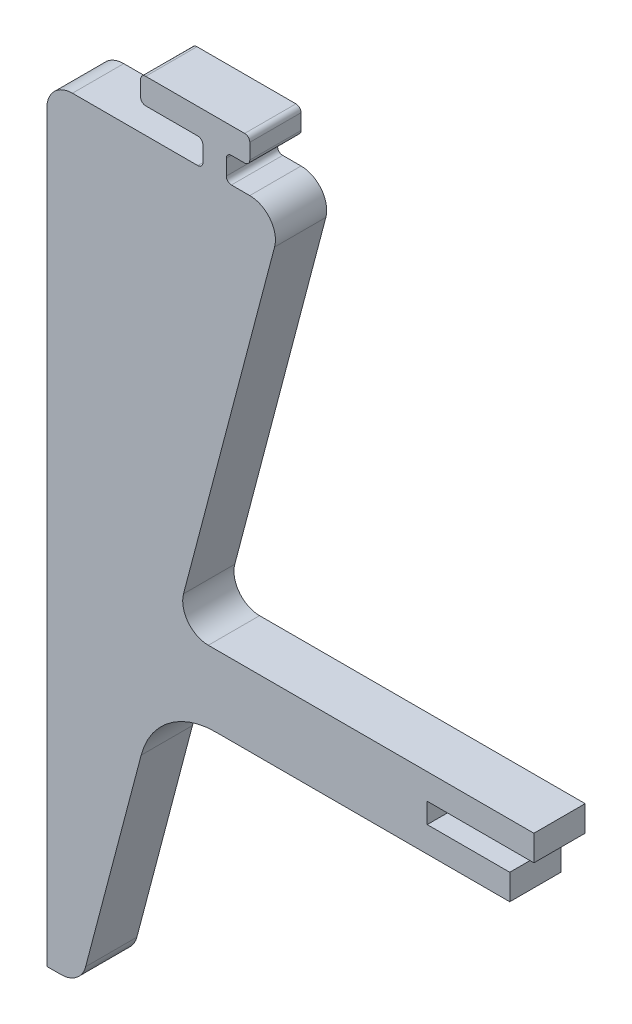
ISO-10303-21;
HEADER;
FILE_DESCRIPTION(('STEP AP214'),'2;1');
FILE_NAME('part.step','',(''),(''),'','','');
FILE_SCHEMA(('AUTOMOTIVE_DESIGN { 1 0 10303 214 1 1 1 1 }'));
ENDSEC;
DATA;
#1=APPLICATION_CONTEXT('core data for automotive mechanical design processes');
#2=APPLICATION_PROTOCOL_DEFINITION('international standard','automotive_design',2000,#1);
#3=PRODUCT_CONTEXT('',#1,'mechanical');
#4=PRODUCT('Part','Part','',(#3));
#5=PRODUCT_RELATED_PRODUCT_CATEGORY('part','',(#4));
#6=PRODUCT_DEFINITION_FORMATION('','',#4);
#7=PRODUCT_DEFINITION_CONTEXT('part definition',#1,'design');
#8=PRODUCT_DEFINITION('design','',#6,#7);
#9=PRODUCT_DEFINITION_SHAPE('','',#8);
#10=(LENGTH_UNIT() NAMED_UNIT(*) SI_UNIT(.MILLI.,.METRE.));
#11=(NAMED_UNIT(*) PLANE_ANGLE_UNIT() SI_UNIT($,.RADIAN.));
#12=(NAMED_UNIT(*) SI_UNIT($,.STERADIAN.) SOLID_ANGLE_UNIT());
#13=UNCERTAINTY_MEASURE_WITH_UNIT(LENGTH_MEASURE(1.E-05),#10,'distance_accuracy_value','');
#14=(GEOMETRIC_REPRESENTATION_CONTEXT(3) GLOBAL_UNCERTAINTY_ASSIGNED_CONTEXT((#13)) GLOBAL_UNIT_ASSIGNED_CONTEXT((#10,
#11,#12)) REPRESENTATION_CONTEXT('',''));
#15=CARTESIAN_POINT('',(0.,0.,0.));
#16=DIRECTION('',(0.,0.,1.));
#17=DIRECTION('',(1.,0.,0.));
#18=AXIS2_PLACEMENT_3D('',#15,#16,#17);
#19=CARTESIAN_POINT('',(-8.43477490578232,2.2206260896086,5.08));
#20=DIRECTION('',(0.96704776858186,-0.254594998538551,0.));
#21=DIRECTION('',(0.254594998538551,0.96704776858186,0.));
#22=AXIS2_PLACEMENT_3D('',#19,#20,#21);
#23=PLANE('',#22);
#24=DIRECTION('',(-0.254594998538551,-0.96704776858186,0.));
#25=VECTOR('',#24,1.);
#26=CARTESIAN_POINT('',(-8.43477490578232,2.2206260896086,5.08));
#27=LINE('',#26,#25);
#28=CARTESIAN_POINT('',(3.515777518992,47.613328703712,5.08));
#29=VERTEX_POINT('',#28);
#30=CARTESIAN_POINT('',(-5.50561715870605,13.3466712962879,5.08));
#31=VERTEX_POINT('',#30);
#32=EDGE_CURVE('E398',#29,#31,#27,.T.);
#33=ORIENTED_EDGE('',*,*,#32,.T.);
#34=DIRECTION('',(0.,0.,1.));
#35=VECTOR('',#34,1.);
#36=CARTESIAN_POINT('',(-5.50561715870605,13.3466712962879,-42.0535776026953));
#37=LINE('',#36,#35);
#38=CARTESIAN_POINT('',(-5.50561715870605,13.3466712962879,0.));
#39=VERTEX_POINT('',#38);
#40=EDGE_CURVE('E529',#39,#31,#37,.T.);
#41=ORIENTED_EDGE('',*,*,#40,.F.);
#42=DIRECTION('',(-0.254594998538551,-0.96704776858186,0.));
#43=VECTOR('',#42,1.);
#44=CARTESIAN_POINT('',(-8.43477490578232,2.2206260896086,0.));
#45=LINE('',#44,#43);
#46=CARTESIAN_POINT('',(3.515777518992,47.613328703712,0.));
#47=VERTEX_POINT('',#46);
#48=EDGE_CURVE('E280',#47,#39,#45,.T.);
#49=ORIENTED_EDGE('',*,*,#48,.F.);
#50=DIRECTION('',(0.,0.,-1.));
#51=VECTOR('',#50,1.);
#52=CARTESIAN_POINT('',(3.515777518992,47.613328703712,5.08));
#53=LINE('',#52,#51);
#54=EDGE_CURVE('E306',#29,#47,#53,.T.);
#55=ORIENTED_EDGE('',*,*,#54,.F.);
#56=EDGE_LOOP('',(#33,#41,#49,#55));
#57=FACE_BOUND('',#56,.T.);
#58=ADVANCED_FACE('F37',(#57),#23,.T.);
#59=CARTESIAN_POINT('',(0.551476186794056,53.848,5.08));
#60=DIRECTION('',(0.,0.,-1.));
#61=DIRECTION('',(-1.,0.,0.));
#62=AXIS2_PLACEMENT_3D('',#59,#60,#61);
#63=CYLINDRICAL_SURFACE('',#62,0.508000000000001);
#64=CARTESIAN_POINT('',(0.551476186794056,53.848,0.));
#65=DIRECTION('',(0.,0.,1.));
#66=DIRECTION('',(1.,0.,0.));
#67=AXIS2_PLACEMENT_3D('',#64,#65,#66);
#68=CIRCLE('',#67,0.508000000000001);
#69=CARTESIAN_POINT('',(1.05947618679406,53.848,0.));
#70=VERTEX_POINT('',#69);
#71=CARTESIAN_POINT('',(0.551476186794052,53.34,0.));
#72=VERTEX_POINT('',#71);
#73=EDGE_CURVE('E236',#70,#72,#68,.F.);
#74=ORIENTED_EDGE('',*,*,#73,.F.);
#75=DIRECTION('',(0.,0.,-1.));
#76=VECTOR('',#75,1.);
#77=CARTESIAN_POINT('',(1.05947618679406,53.848,5.08));
#78=LINE('',#77,#76);
#79=CARTESIAN_POINT('',(1.05947618679406,53.848,5.08));
#80=VERTEX_POINT('',#79);
#81=EDGE_CURVE('E11',#80,#70,#78,.T.);
#82=ORIENTED_EDGE('',*,*,#81,.F.);
#83=CARTESIAN_POINT('',(0.551476186794056,53.848,5.08));
#84=DIRECTION('',(0.,0.,1.));
#85=DIRECTION('',(1.,0.,0.));
#86=AXIS2_PLACEMENT_3D('',#83,#84,#85);
#87=CIRCLE('',#86,0.508000000000001);
#88=CARTESIAN_POINT('',(0.551476186794052,53.34,5.08));
#89=VERTEX_POINT('',#88);
#90=EDGE_CURVE('E298',#80,#89,#87,.F.);
#91=ORIENTED_EDGE('',*,*,#90,.T.);
#92=DIRECTION('',(0.,0.,-1.));
#93=VECTOR('',#92,1.);
#94=CARTESIAN_POINT('',(0.551476186794052,53.34,5.08));
#95=LINE('',#94,#93);
#96=EDGE_CURVE('E61',#89,#72,#95,.T.);
#97=ORIENTED_EDGE('',*,*,#96,.T.);
#98=EDGE_LOOP('',(#74,#82,#91,#97));
#99=FACE_BOUND('',#98,.T.);
#100=ADVANCED_FACE('F39',(#99),#63,.T.);
#101=CARTESIAN_POINT('',(1.05947618679406,0.,5.08));
#102=DIRECTION('',(1.,0.,0.));
#103=DIRECTION('',(0.,0.,-1.));
#104=AXIS2_PLACEMENT_3D('',#101,#102,#103);
#105=PLANE('',#104);
#106=DIRECTION('',(0.,-1.,0.));
#107=VECTOR('',#106,1.);
#108=CARTESIAN_POINT('',(1.05947618679406,0.,0.));
#109=LINE('',#108,#107);
#110=CARTESIAN_POINT('',(1.05947618679406,55.372,0.));
#111=VERTEX_POINT('',#110);
#112=EDGE_CURVE('E238',#111,#70,#109,.T.);
#113=ORIENTED_EDGE('',*,*,#112,.F.);
#114=DIRECTION('',(0.,0.,-1.));
#115=VECTOR('',#114,1.);
#116=CARTESIAN_POINT('',(1.05947618679406,55.372,5.08));
#117=LINE('',#116,#115);
#118=CARTESIAN_POINT('',(1.05947618679406,55.372,5.08));
#119=VERTEX_POINT('',#118);
#120=EDGE_CURVE('E45',#119,#111,#117,.T.);
#121=ORIENTED_EDGE('',*,*,#120,.F.);
#122=DIRECTION('',(0.,-1.,0.));
#123=VECTOR('',#122,1.);
#124=CARTESIAN_POINT('',(1.05947618679406,0.,5.08));
#125=LINE('',#124,#123);
#126=EDGE_CURVE('E364',#119,#80,#125,.T.);
#127=ORIENTED_EDGE('',*,*,#126,.T.);
#128=ORIENTED_EDGE('',*,*,#81,.T.);
#129=EDGE_LOOP('',(#113,#121,#127,#128));
#130=FACE_BOUND('',#129,.T.);
#131=ADVANCED_FACE('F351',(#130),#105,.T.);
#132=CARTESIAN_POINT('',(0.551476186794056,55.372,5.08));
#133=DIRECTION('',(0.,0.,-1.));
#134=DIRECTION('',(-1.,0.,0.));
#135=AXIS2_PLACEMENT_3D('',#132,#133,#134);
#136=CYLINDRICAL_SURFACE('',#135,0.508000000000001);
#137=CARTESIAN_POINT('',(0.551476186794056,55.372,0.));
#138=DIRECTION('',(0.,0.,1.));
#139=DIRECTION('',(1.,0.,0.));
#140=AXIS2_PLACEMENT_3D('',#137,#138,#139);
#141=CIRCLE('',#140,0.508000000000001);
#142=CARTESIAN_POINT('',(0.551476186794052,55.88,0.));
#143=VERTEX_POINT('',#142);
#144=EDGE_CURVE('E242',#143,#111,#141,.F.);
#145=ORIENTED_EDGE('',*,*,#144,.F.);
#146=DIRECTION('',(0.,0.,-1.));
#147=VECTOR('',#146,1.);
#148=CARTESIAN_POINT('',(0.551476186794052,55.88,5.08));
#149=LINE('',#148,#147);
#150=CARTESIAN_POINT('',(0.551476186794052,55.88,5.08));
#151=VERTEX_POINT('',#150);
#152=EDGE_CURVE('E340',#151,#143,#149,.T.);
#153=ORIENTED_EDGE('',*,*,#152,.F.);
#154=CARTESIAN_POINT('',(0.551476186794056,55.372,5.08));
#155=DIRECTION('',(0.,0.,1.));
#156=DIRECTION('',(1.,0.,0.));
#157=AXIS2_PLACEMENT_3D('',#154,#155,#156);
#158=CIRCLE('',#157,0.508000000000001);
#159=EDGE_CURVE('E347',#151,#119,#158,.F.);
#160=ORIENTED_EDGE('',*,*,#159,.T.);
#161=ORIENTED_EDGE('',*,*,#120,.T.);
#162=EDGE_LOOP('',(#145,#153,#160,#161));
#163=FACE_BOUND('',#162,.T.);
#164=ADVANCED_FACE('F345',(#163),#136,.T.);
#165=CARTESIAN_POINT('',(0.,55.88,5.08));
#166=DIRECTION('',(0.,1.,0.));
#167=DIRECTION('',(0.,0.,1.));
#168=AXIS2_PLACEMENT_3D('',#165,#166,#167);
#169=PLANE('',#168);
#170=DIRECTION('',(1.,0.,0.));
#171=VECTOR('',#170,1.);
#172=CARTESIAN_POINT('',(0.,55.88,0.));
#173=LINE('',#172,#171);
#174=CARTESIAN_POINT('',(-9.2514879293255,55.88,0.));
#175=VERTEX_POINT('',#174);
#176=EDGE_CURVE('E245',#175,#143,#173,.T.);
#177=ORIENTED_EDGE('',*,*,#176,.F.);
#178=DIRECTION('',(0.,0.,-1.));
#179=VECTOR('',#178,1.);
#180=CARTESIAN_POINT('',(-9.2514879293255,55.88,5.08));
#181=LINE('',#180,#179);
#182=CARTESIAN_POINT('',(-9.2514879293255,55.88,5.08));
#183=VERTEX_POINT('',#182);
#184=EDGE_CURVE('E338',#183,#175,#181,.T.);
#185=ORIENTED_EDGE('',*,*,#184,.F.);
#186=DIRECTION('',(1.,0.,0.));
#187=VECTOR('',#186,1.);
#188=CARTESIAN_POINT('',(0.,55.88,5.08));
#189=LINE('',#188,#187);
#190=EDGE_CURVE('E361',#183,#151,#189,.T.);
#191=ORIENTED_EDGE('',*,*,#190,.T.);
#192=ORIENTED_EDGE('',*,*,#152,.T.);
#193=EDGE_LOOP('',(#177,#185,#191,#192));
#194=FACE_BOUND('',#193,.T.);
#195=ADVANCED_FACE('F358',(#194),#169,.T.);
#196=CARTESIAN_POINT('',(-9.25148792932551,55.372,5.08));
#197=DIRECTION('',(0.,0.,-1.));
#198=DIRECTION('',(-1.,0.,0.));
#199=AXIS2_PLACEMENT_3D('',#196,#197,#198);
#200=CYLINDRICAL_SURFACE('',#199,0.508000000000001);
#201=CARTESIAN_POINT('',(-9.25148792932551,55.372,0.));
#202=DIRECTION('',(0.,0.,1.));
#203=DIRECTION('',(1.,0.,0.));
#204=AXIS2_PLACEMENT_3D('',#201,#202,#203);
#205=CIRCLE('',#204,0.508000000000001);
#206=CARTESIAN_POINT('',(-9.75948792932551,55.372,0.));
#207=VERTEX_POINT('',#206);
#208=EDGE_CURVE('E248',#207,#175,#205,.F.);
#209=ORIENTED_EDGE('',*,*,#208,.F.);
#210=DIRECTION('',(0.,0.,-1.));
#211=VECTOR('',#210,1.);
#212=CARTESIAN_POINT('',(-9.75948792932551,55.372,5.08));
#213=LINE('',#212,#211);
#214=CARTESIAN_POINT('',(-9.75948792932551,55.372,5.08));
#215=VERTEX_POINT('',#214);
#216=EDGE_CURVE('E336',#215,#207,#213,.T.);
#217=ORIENTED_EDGE('',*,*,#216,.F.);
#218=CARTESIAN_POINT('',(-9.25148792932551,55.372,5.08));
#219=DIRECTION('',(0.,0.,1.));
#220=DIRECTION('',(1.,0.,0.));
#221=AXIS2_PLACEMENT_3D('',#218,#219,#220);
#222=CIRCLE('',#221,0.508000000000001);
#223=EDGE_CURVE('E366',#215,#183,#222,.F.);
#224=ORIENTED_EDGE('',*,*,#223,.T.);
#225=ORIENTED_EDGE('',*,*,#184,.T.);
#226=EDGE_LOOP('',(#209,#217,#224,#225));
#227=FACE_BOUND('',#226,.T.);
#228=ADVANCED_FACE('F851',(#227),#200,.T.);
#229=CARTESIAN_POINT('',(-9.75948792932551,0.,5.08));
#230=DIRECTION('',(1.,0.,0.));
#231=DIRECTION('',(0.,0.,-1.));
#232=AXIS2_PLACEMENT_3D('',#229,#230,#231);
#233=PLANE('',#232);
#234=DIRECTION('',(0.,-1.,0.));
#235=VECTOR('',#234,1.);
#236=CARTESIAN_POINT('',(-9.75948792932551,0.,0.));
#237=LINE('',#236,#235);
#238=CARTESIAN_POINT('',(-9.75948792932551,53.848,0.));
#239=VERTEX_POINT('',#238);
#240=EDGE_CURVE('E251',#207,#239,#237,.T.);
#241=ORIENTED_EDGE('',*,*,#240,.T.);
#242=DIRECTION('',(0.,0.,-1.));
#243=VECTOR('',#242,1.);
#244=CARTESIAN_POINT('',(-9.75948792932551,53.848,5.08));
#245=LINE('',#244,#243);
#246=CARTESIAN_POINT('',(-9.75948792932551,53.848,5.08));
#247=VERTEX_POINT('',#246);
#248=EDGE_CURVE('E333',#247,#239,#245,.T.);
#249=ORIENTED_EDGE('',*,*,#248,.F.);
#250=DIRECTION('',(0.,-1.,0.));
#251=VECTOR('',#250,1.);
#252=CARTESIAN_POINT('',(-9.75948792932551,0.,5.08));
#253=LINE('',#252,#251);
#254=EDGE_CURVE('E372',#215,#247,#253,.T.);
#255=ORIENTED_EDGE('',*,*,#254,.F.);
#256=ORIENTED_EDGE('',*,*,#216,.T.);
#257=EDGE_LOOP('',(#241,#249,#255,#256));
#258=FACE_BOUND('',#257,.T.);
#259=ADVANCED_FACE('F841',(#258),#233,.F.);
#260=CARTESIAN_POINT('',(-9.25148792932551,53.848,5.08));
#261=DIRECTION('',(0.,0.,-1.));
#262=DIRECTION('',(-1.,0.,0.));
#263=AXIS2_PLACEMENT_3D('',#260,#261,#262);
#264=CYLINDRICAL_SURFACE('',#263,0.508000000000001);
#265=CARTESIAN_POINT('',(-9.25148792932551,53.848,0.));
#266=DIRECTION('',(0.,0.,1.));
#267=DIRECTION('',(1.,0.,0.));
#268=AXIS2_PLACEMENT_3D('',#265,#266,#267);
#269=CIRCLE('',#268,0.508000000000001);
#270=CARTESIAN_POINT('',(-9.2514879293255,53.34,0.));
#271=VERTEX_POINT('',#270);
#272=EDGE_CURVE('E253',#239,#271,#269,.T.);
#273=ORIENTED_EDGE('',*,*,#272,.T.);
#274=DIRECTION('',(0.,0.,-1.));
#275=VECTOR('',#274,1.);
#276=CARTESIAN_POINT('',(-9.2514879293255,53.34,5.08));
#277=LINE('',#276,#275);
#278=CARTESIAN_POINT('',(-9.2514879293255,53.34,5.08));
#279=VERTEX_POINT('',#278);
#280=EDGE_CURVE('E330',#279,#271,#277,.T.);
#281=ORIENTED_EDGE('',*,*,#280,.F.);
#282=CARTESIAN_POINT('',(-9.25148792932551,53.848,5.08));
#283=DIRECTION('',(0.,0.,1.));
#284=DIRECTION('',(1.,0.,0.));
#285=AXIS2_PLACEMENT_3D('',#282,#283,#284);
#286=CIRCLE('',#285,0.508000000000001);
#287=EDGE_CURVE('E374',#247,#279,#286,.T.);
#288=ORIENTED_EDGE('',*,*,#287,.F.);
#289=ORIENTED_EDGE('',*,*,#248,.T.);
#290=EDGE_LOOP('',(#273,#281,#288,#289));
#291=FACE_BOUND('',#290,.T.);
#292=ADVANCED_FACE('F831',(#291),#264,.T.);
#293=CARTESIAN_POINT('',(0.,53.34,5.08));
#294=DIRECTION('',(0.,1.,0.));
#295=DIRECTION('',(0.,0.,1.));
#296=AXIS2_PLACEMENT_3D('',#293,#294,#295);
#297=PLANE('',#296);
#298=DIRECTION('',(1.,0.,0.));
#299=VECTOR('',#298,1.);
#300=CARTESIAN_POINT('',(0.,53.34,0.));
#301=LINE('',#300,#299);
#302=CARTESIAN_POINT('',(-4.092493286829,53.34,0.));
#303=VERTEX_POINT('',#302);
#304=EDGE_CURVE('E255',#271,#303,#301,.T.);
#305=ORIENTED_EDGE('',*,*,#304,.T.);
#306=DIRECTION('',(0.,0.,-1.));
#307=VECTOR('',#306,1.);
#308=CARTESIAN_POINT('',(-4.092493286829,53.34,5.08));
#309=LINE('',#308,#307);
#310=CARTESIAN_POINT('',(-4.092493286829,53.34,5.08));
#311=VERTEX_POINT('',#310);
#312=EDGE_CURVE('E328',#311,#303,#309,.T.);
#313=ORIENTED_EDGE('',*,*,#312,.F.);
#314=DIRECTION('',(1.,0.,0.));
#315=VECTOR('',#314,1.);
#316=CARTESIAN_POINT('',(0.,53.34,5.08));
#317=LINE('',#316,#315);
#318=EDGE_CURVE('E376',#279,#311,#317,.T.);
#319=ORIENTED_EDGE('',*,*,#318,.F.);
#320=ORIENTED_EDGE('',*,*,#280,.T.);
#321=EDGE_LOOP('',(#305,#313,#319,#320));
#322=FACE_BOUND('',#321,.T.);
#323=ADVANCED_FACE('F821',(#322),#297,.F.);
#324=CARTESIAN_POINT('',(-4.092493286829,52.832,5.08));
#325=DIRECTION('',(0.,0.,-1.));
#326=DIRECTION('',(-1.,0.,0.));
#327=AXIS2_PLACEMENT_3D('',#324,#325,#326);
#328=CYLINDRICAL_SURFACE('',#327,0.508000000000001);
#329=CARTESIAN_POINT('',(-4.092493286829,52.832,0.));
#330=DIRECTION('',(0.,0.,1.));
#331=DIRECTION('',(1.,0.,0.));
#332=AXIS2_PLACEMENT_3D('',#329,#330,#331);
#333=CIRCLE('',#332,0.508000000000001);
#334=CARTESIAN_POINT('',(-3.584493286829,52.832,0.));
#335=VERTEX_POINT('',#334);
#336=EDGE_CURVE('E258',#335,#303,#333,.T.);
#337=ORIENTED_EDGE('',*,*,#336,.F.);
#338=DIRECTION('',(0.,0.,-1.));
#339=VECTOR('',#338,1.);
#340=CARTESIAN_POINT('',(-3.584493286829,52.832,5.08));
#341=LINE('',#340,#339);
#342=CARTESIAN_POINT('',(-3.584493286829,52.832,5.08));
#343=VERTEX_POINT('',#342);
#344=EDGE_CURVE('E326',#343,#335,#341,.T.);
#345=ORIENTED_EDGE('',*,*,#344,.F.);
#346=CARTESIAN_POINT('',(-4.092493286829,52.832,5.08));
#347=DIRECTION('',(0.,0.,1.));
#348=DIRECTION('',(1.,0.,0.));
#349=AXIS2_PLACEMENT_3D('',#346,#347,#348);
#350=CIRCLE('',#349,0.508000000000001);
#351=EDGE_CURVE('E378',#343,#311,#350,.T.);
#352=ORIENTED_EDGE('',*,*,#351,.T.);
#353=ORIENTED_EDGE('',*,*,#312,.T.);
#354=EDGE_LOOP('',(#337,#345,#352,#353));
#355=FACE_BOUND('',#354,.T.);
#356=ADVANCED_FACE('F811',(#355),#328,.F.);
#357=CARTESIAN_POINT('',(-3.58449328682899,0.,5.08));
#358=DIRECTION('',(1.,0.,0.));
#359=DIRECTION('',(0.,1.,0.));
#360=AXIS2_PLACEMENT_3D('',#357,#358,#359);
#361=PLANE('',#360);
#362=DIRECTION('',(0.,-1.,0.));
#363=VECTOR('',#362,1.);
#364=CARTESIAN_POINT('',(-3.58449328682899,0.,0.));
#365=LINE('',#364,#363);
#366=CARTESIAN_POINT('',(-3.584493286829,51.308,0.));
#367=VERTEX_POINT('',#366);
#368=EDGE_CURVE('E261',#335,#367,#365,.T.);
#369=ORIENTED_EDGE('',*,*,#368,.T.);
#370=DIRECTION('',(0.,0.,-1.));
#371=VECTOR('',#370,1.);
#372=CARTESIAN_POINT('',(-3.584493286829,51.308,5.08));
#373=LINE('',#372,#371);
#374=CARTESIAN_POINT('',(-3.584493286829,51.308,5.08));
#375=VERTEX_POINT('',#374);
#376=EDGE_CURVE('E323',#375,#367,#373,.T.);
#377=ORIENTED_EDGE('',*,*,#376,.F.);
#378=DIRECTION('',(0.,-1.,0.));
#379=VECTOR('',#378,1.);
#380=CARTESIAN_POINT('',(-3.58449328682899,0.,5.08));
#381=LINE('',#380,#379);
#382=EDGE_CURVE('E381',#343,#375,#381,.T.);
#383=ORIENTED_EDGE('',*,*,#382,.F.);
#384=ORIENTED_EDGE('',*,*,#344,.T.);
#385=EDGE_LOOP('',(#369,#377,#383,#384));
#386=FACE_BOUND('',#385,.T.);
#387=ADVANCED_FACE('F801',(#386),#361,.F.);
#388=CARTESIAN_POINT('',(-4.092493286829,51.308,5.08));
#389=DIRECTION('',(0.,0.,-1.));
#390=DIRECTION('',(-1.,0.,0.));
#391=AXIS2_PLACEMENT_3D('',#388,#389,#390);
#392=CYLINDRICAL_SURFACE('',#391,0.508000000000001);
#393=CARTESIAN_POINT('',(-4.092493286829,51.308,0.));
#394=DIRECTION('',(0.,0.,1.));
#395=DIRECTION('',(1.,0.,0.));
#396=AXIS2_PLACEMENT_3D('',#393,#394,#395);
#397=CIRCLE('',#396,0.508000000000001);
#398=CARTESIAN_POINT('',(-4.092493286829,50.8,0.));
#399=VERTEX_POINT('',#398);
#400=EDGE_CURVE('E263',#367,#399,#397,.F.);
#401=ORIENTED_EDGE('',*,*,#400,.T.);
#402=DIRECTION('',(0.,0.,-1.));
#403=VECTOR('',#402,1.);
#404=CARTESIAN_POINT('',(-4.092493286829,50.8,5.08));
#405=LINE('',#404,#403);
#406=CARTESIAN_POINT('',(-4.092493286829,50.8,5.08));
#407=VERTEX_POINT('',#406);
#408=EDGE_CURVE('E320',#407,#399,#405,.T.);
#409=ORIENTED_EDGE('',*,*,#408,.F.);
#410=CARTESIAN_POINT('',(-4.092493286829,51.308,5.08));
#411=DIRECTION('',(0.,0.,1.));
#412=DIRECTION('',(1.,0.,0.));
#413=AXIS2_PLACEMENT_3D('',#410,#411,#412);
#414=CIRCLE('',#413,0.508000000000001);
#415=EDGE_CURVE('E383',#375,#407,#414,.F.);
#416=ORIENTED_EDGE('',*,*,#415,.F.);
#417=ORIENTED_EDGE('',*,*,#376,.T.);
#418=EDGE_LOOP('',(#401,#409,#416,#417));
#419=FACE_BOUND('',#418,.T.);
#420=ADVANCED_FACE('F791',(#419),#392,.F.);
#421=CARTESIAN_POINT('',(0.,50.8,5.08));
#422=DIRECTION('',(0.,-1.,0.));
#423=DIRECTION('',(0.,0.,-1.));
#424=AXIS2_PLACEMENT_3D('',#421,#422,#423);
#425=PLANE('',#424);
#426=DIRECTION('',(-1.,0.,0.));
#427=VECTOR('',#426,1.);
#428=CARTESIAN_POINT('',(0.,50.8,0.));
#429=LINE('',#428,#427);
#430=CARTESIAN_POINT('',(-16.51,50.8,0.));
#431=VERTEX_POINT('',#430);
#432=EDGE_CURVE('E265',#399,#431,#429,.T.);
#433=ORIENTED_EDGE('',*,*,#432,.T.);
#434=DIRECTION('',(0.,0.,-1.));
#435=VECTOR('',#434,1.);
#436=CARTESIAN_POINT('',(-16.51,50.8,5.08));
#437=LINE('',#436,#435);
#438=CARTESIAN_POINT('',(-16.51,50.8,5.08));
#439=VERTEX_POINT('',#438);
#440=EDGE_CURVE('E318',#439,#431,#437,.T.);
#441=ORIENTED_EDGE('',*,*,#440,.F.);
#442=DIRECTION('',(-1.,0.,0.));
#443=VECTOR('',#442,1.);
#444=CARTESIAN_POINT('',(0.,50.8,5.08));
#445=LINE('',#444,#443);
#446=EDGE_CURVE('E385',#407,#439,#445,.T.);
#447=ORIENTED_EDGE('',*,*,#446,.F.);
#448=ORIENTED_EDGE('',*,*,#408,.T.);
#449=EDGE_LOOP('',(#433,#441,#447,#448));
#450=FACE_BOUND('',#449,.T.);
#451=ADVANCED_FACE('F781',(#450),#425,.F.);
#452=CARTESIAN_POINT('',(-16.51,48.26,5.08));
#453=DIRECTION('',(0.,0.,-1.));
#454=DIRECTION('',(-1.,0.,0.));
#455=AXIS2_PLACEMENT_3D('',#452,#453,#454);
#456=CYLINDRICAL_SURFACE('',#455,2.54);
#457=CARTESIAN_POINT('',(-16.51,48.26,0.));
#458=DIRECTION('',(0.,0.,1.));
#459=DIRECTION('',(1.,0.,0.));
#460=AXIS2_PLACEMENT_3D('',#457,#458,#459);
#461=CIRCLE('',#460,2.54);
#462=CARTESIAN_POINT('',(-19.05,48.26,0.));
#463=VERTEX_POINT('',#462);
#464=EDGE_CURVE('E268',#463,#431,#461,.F.);
#465=ORIENTED_EDGE('',*,*,#464,.F.);
#466=DIRECTION('',(0.,0.,-1.));
#467=VECTOR('',#466,1.);
#468=CARTESIAN_POINT('',(-19.05,48.26,5.08));
#469=LINE('',#468,#467);
#470=CARTESIAN_POINT('',(-19.05,48.26,5.08));
#471=VERTEX_POINT('',#470);
#472=EDGE_CURVE('E316',#471,#463,#469,.T.);
#473=ORIENTED_EDGE('',*,*,#472,.F.);
#474=CARTESIAN_POINT('',(-16.51,48.26,5.08));
#475=DIRECTION('',(0.,0.,1.));
#476=DIRECTION('',(1.,0.,0.));
#477=AXIS2_PLACEMENT_3D('',#474,#475,#476);
#478=CIRCLE('',#477,2.54);
#479=EDGE_CURVE('E387',#471,#439,#478,.F.);
#480=ORIENTED_EDGE('',*,*,#479,.T.);
#481=ORIENTED_EDGE('',*,*,#440,.T.);
#482=EDGE_LOOP('',(#465,#473,#480,#481));
#483=FACE_BOUND('',#482,.T.);
#484=ADVANCED_FACE('F771',(#483),#456,.T.);
#485=CARTESIAN_POINT('',(-19.05,0.,5.08));
#486=DIRECTION('',(1.,0.,0.));
#487=DIRECTION('',(0.,1.,0.));
#488=AXIS2_PLACEMENT_3D('',#485,#486,#487);
#489=PLANE('',#488);
#490=DIRECTION('',(0.,-1.,0.));
#491=VECTOR('',#490,1.);
#492=CARTESIAN_POINT('',(-19.05,0.,0.));
#493=LINE('',#492,#491);
#494=CARTESIAN_POINT('',(-19.05,-25.4,0.));
#495=VERTEX_POINT('',#494);
#496=EDGE_CURVE('E271',#463,#495,#493,.T.);
#497=ORIENTED_EDGE('',*,*,#496,.T.);
#498=DIRECTION('',(0.,0.,-1.));
#499=VECTOR('',#498,1.);
#500=CARTESIAN_POINT('',(-19.05,-25.4,5.08));
#501=LINE('',#500,#499);
#502=CARTESIAN_POINT('',(-19.05,-25.4,5.08));
#503=VERTEX_POINT('',#502);
#504=EDGE_CURVE('E313',#503,#495,#501,.T.);
#505=ORIENTED_EDGE('',*,*,#504,.F.);
#506=DIRECTION('',(0.,-1.,0.));
#507=VECTOR('',#506,1.);
#508=CARTESIAN_POINT('',(-19.05,0.,5.08));
#509=LINE('',#508,#507);
#510=EDGE_CURVE('E390',#471,#503,#509,.T.);
#511=ORIENTED_EDGE('',*,*,#510,.F.);
#512=ORIENTED_EDGE('',*,*,#472,.T.);
#513=EDGE_LOOP('',(#497,#505,#511,#512));
#514=FACE_BOUND('',#513,.T.);
#515=ADVANCED_FACE('F761',(#514),#489,.F.);
#516=CARTESIAN_POINT('',(0.,-25.4,5.08));
#517=DIRECTION('',(0.,1.,0.));
#518=DIRECTION('',(-1.,0.,0.));
#519=AXIS2_PLACEMENT_3D('',#516,#517,#518);
#520=PLANE('',#519);
#521=DIRECTION('',(1.,0.,0.));
#522=VECTOR('',#521,1.);
#523=CARTESIAN_POINT('',(0.,-25.4,0.));
#524=LINE('',#523,#522);
#525=CARTESIAN_POINT('',(-17.6643106666875,-25.4,0.));
#526=VERTEX_POINT('',#525);
#527=EDGE_CURVE('E273',#495,#526,#524,.T.);
#528=ORIENTED_EDGE('',*,*,#527,.T.);
#529=DIRECTION('',(0.,0.,-1.));
#530=VECTOR('',#529,1.);
#531=CARTESIAN_POINT('',(-17.6643106666875,-25.4,5.08));
#532=LINE('',#531,#530);
#533=CARTESIAN_POINT('',(-17.6643106666875,-25.4,5.08));
#534=VERTEX_POINT('',#533);
#535=EDGE_CURVE('E311',#534,#526,#532,.T.);
#536=ORIENTED_EDGE('',*,*,#535,.F.);
#537=DIRECTION('',(1.,0.,0.));
#538=VECTOR('',#537,1.);
#539=CARTESIAN_POINT('',(0.,-25.4,5.08));
#540=LINE('',#539,#538);
#541=EDGE_CURVE('E392',#503,#534,#540,.T.);
#542=ORIENTED_EDGE('',*,*,#541,.F.);
#543=ORIENTED_EDGE('',*,*,#504,.T.);
#544=EDGE_LOOP('',(#528,#536,#542,#543));
#545=FACE_BOUND('',#544,.T.);
#546=ADVANCED_FACE('F441',(#545),#520,.F.);
#547=CARTESIAN_POINT('',(-17.6643106666875,-22.86,5.08));
#548=DIRECTION('',(0.,0.,-1.));
#549=DIRECTION('',(-1.,0.,0.));
#550=AXIS2_PLACEMENT_3D('',#547,#548,#549);
#551=CYLINDRICAL_SURFACE('',#550,2.54);
#552=CARTESIAN_POINT('',(-17.6643106666875,-22.86,0.));
#553=DIRECTION('',(0.,0.,1.));
#554=DIRECTION('',(1.,0.,0.));
#555=AXIS2_PLACEMENT_3D('',#552,#553,#554);
#556=CIRCLE('',#555,2.54);
#557=CARTESIAN_POINT('',(-15.2080093344896,-23.5066712962879,0.));
#558=VERTEX_POINT('',#557);
#559=EDGE_CURVE('E276',#558,#526,#556,.F.);
#560=ORIENTED_EDGE('',*,*,#559,.F.);
#561=DIRECTION('',(0.,0.,-1.));
#562=VECTOR('',#561,1.);
#563=CARTESIAN_POINT('',(-15.2080093344896,-23.5066712962879,5.08));
#564=LINE('',#563,#562);
#565=CARTESIAN_POINT('',(-15.2080093344896,-23.5066712962879,5.08));
#566=VERTEX_POINT('',#565);
#567=EDGE_CURVE('E308',#566,#558,#564,.T.);
#568=ORIENTED_EDGE('',*,*,#567,.F.);
#569=CARTESIAN_POINT('',(-17.6643106666875,-22.86,5.08));
#570=DIRECTION('',(0.,0.,1.));
#571=DIRECTION('',(1.,0.,0.));
#572=AXIS2_PLACEMENT_3D('',#569,#570,#571);
#573=CIRCLE('',#572,2.54);
#574=EDGE_CURVE('E394',#566,#534,#573,.F.);
#575=ORIENTED_EDGE('',*,*,#574,.T.);
#576=ORIENTED_EDGE('',*,*,#535,.T.);
#577=EDGE_LOOP('',(#560,#568,#575,#576));
#578=FACE_BOUND('',#577,.T.);
#579=ADVANCED_FACE('F435',(#578),#551,.T.);
#580=DIRECTION('',(0.,0.,1.));
#581=VECTOR('',#580,1.);
#582=CARTESIAN_POINT('',(-9.7034767528667,-2.59838173560935,-42.0535776026953));
#583=LINE('',#582,#581);
#584=CARTESIAN_POINT('',(-9.70347675286668,-2.59838173560931,0.));
#585=VERTEX_POINT('',#584);
#586=CARTESIAN_POINT('',(-9.7034767528667,-2.59838173560935,5.08));
#587=VERTEX_POINT('',#586);
#588=EDGE_CURVE('E52',#585,#587,#583,.T.);
#589=ORIENTED_EDGE('',*,*,#588,.T.);
#590=EDGE_CURVE('E397',#587,#566,#27,.T.);
#591=ORIENTED_EDGE('',*,*,#590,.T.);
#592=ORIENTED_EDGE('',*,*,#567,.T.);
#593=EDGE_CURVE('E279',#585,#558,#45,.T.);
#594=ORIENTED_EDGE('',*,*,#593,.F.);
#595=EDGE_LOOP('',(#589,#591,#592,#594));
#596=FACE_BOUND('',#595,.T.);
#597=ADVANCED_FACE('F428',(#596),#23,.T.);
#598=CARTESIAN_POINT('',(1.05947618679408,48.26,5.08));
#599=DIRECTION('',(0.,0.,-1.));
#600=DIRECTION('',(-1.,0.,0.));
#601=AXIS2_PLACEMENT_3D('',#598,#599,#600);
#602=CYLINDRICAL_SURFACE('',#601,2.54);
#603=CARTESIAN_POINT('',(1.05947618679408,48.26,0.));
#604=DIRECTION('',(0.,0.,1.));
#605=DIRECTION('',(1.,0.,0.));
#606=AXIS2_PLACEMENT_3D('',#603,#604,#605);
#607=CIRCLE('',#606,2.54);
#608=CARTESIAN_POINT('',(1.05947618679406,50.8,0.));
#609=VERTEX_POINT('',#608);
#610=EDGE_CURVE('E283',#47,#609,#607,.T.);
#611=ORIENTED_EDGE('',*,*,#610,.T.);
#612=DIRECTION('',(0.,0.,-1.));
#613=VECTOR('',#612,1.);
#614=CARTESIAN_POINT('',(1.05947618679406,50.8,5.08));
#615=LINE('',#614,#613);
#616=CARTESIAN_POINT('',(1.05947618679406,50.8,5.08));
#617=VERTEX_POINT('',#616);
#618=EDGE_CURVE('E304',#617,#609,#615,.T.);
#619=ORIENTED_EDGE('',*,*,#618,.F.);
#620=CARTESIAN_POINT('',(1.05947618679408,48.26,5.08));
#621=DIRECTION('',(0.,0.,1.));
#622=DIRECTION('',(1.,0.,0.));
#623=AXIS2_PLACEMENT_3D('',#620,#621,#622);
#624=CIRCLE('',#623,2.54);
#625=EDGE_CURVE('E401',#29,#617,#624,.T.);
#626=ORIENTED_EDGE('',*,*,#625,.F.);
#627=ORIENTED_EDGE('',*,*,#54,.T.);
#628=EDGE_LOOP('',(#611,#619,#626,#627));
#629=FACE_BOUND('',#628,.T.);
#630=ADVANCED_FACE('F411',(#629),#602,.T.);
#631=CARTESIAN_POINT('',(0.,50.8,5.08));
#632=DIRECTION('',(0.,1.,0.));
#633=DIRECTION('',(0.,0.,1.));
#634=AXIS2_PLACEMENT_3D('',#631,#632,#633);
#635=PLANE('',#634);
#636=DIRECTION('',(1.,0.,0.));
#637=VECTOR('',#636,1.);
#638=CARTESIAN_POINT('',(0.,50.8,0.));
#639=LINE('',#638,#637);
#640=CARTESIAN_POINT('',(-0.762,50.8,0.));
#641=VERTEX_POINT('',#640);
#642=EDGE_CURVE('E286',#641,#609,#639,.T.);
#643=ORIENTED_EDGE('',*,*,#642,.F.);
#644=DIRECTION('',(0.,0.,-1.));
#645=VECTOR('',#644,1.);
#646=CARTESIAN_POINT('',(-0.762,50.8,5.08));
#647=LINE('',#646,#645);
#648=CARTESIAN_POINT('',(-0.762,50.8,5.08));
#649=VERTEX_POINT('',#648);
#650=EDGE_CURVE('E302',#649,#641,#647,.T.);
#651=ORIENTED_EDGE('',*,*,#650,.F.);
#652=DIRECTION('',(1.,0.,0.));
#653=VECTOR('',#652,1.);
#654=CARTESIAN_POINT('',(0.,50.8,5.08));
#655=LINE('',#654,#653);
#656=EDGE_CURVE('E231',#649,#617,#655,.T.);
#657=ORIENTED_EDGE('',*,*,#656,.T.);
#658=ORIENTED_EDGE('',*,*,#618,.T.);
#659=EDGE_LOOP('',(#643,#651,#657,#658));
#660=FACE_BOUND('',#659,.T.);
#661=ADVANCED_FACE('F405',(#660),#635,.T.);
#662=CARTESIAN_POINT('',(-0.762000000000004,51.308,5.08));
#663=DIRECTION('',(0.,0.,-1.));
#664=DIRECTION('',(-1.,0.,0.));
#665=AXIS2_PLACEMENT_3D('',#662,#663,#664);
#666=CYLINDRICAL_SURFACE('',#665,0.508000000000001);
#667=CARTESIAN_POINT('',(-0.762000000000004,51.308,0.));
#668=DIRECTION('',(0.,0.,1.));
#669=DIRECTION('',(1.,0.,0.));
#670=AXIS2_PLACEMENT_3D('',#667,#668,#669);
#671=CIRCLE('',#670,0.508000000000001);
#672=CARTESIAN_POINT('',(-1.27,51.308,0.));
#673=VERTEX_POINT('',#672);
#674=EDGE_CURVE('E289',#641,#673,#671,.F.);
#675=ORIENTED_EDGE('',*,*,#674,.T.);
#676=DIRECTION('',(0.,0.,-1.));
#677=VECTOR('',#676,1.);
#678=CARTESIAN_POINT('',(-1.27,51.308,5.08));
#679=LINE('',#678,#677);
#680=CARTESIAN_POINT('',(-1.27,51.308,5.08));
#681=VERTEX_POINT('',#680);
#682=EDGE_CURVE('E215',#681,#673,#679,.T.);
#683=ORIENTED_EDGE('',*,*,#682,.F.);
#684=CARTESIAN_POINT('',(-0.762000000000004,51.308,5.08));
#685=DIRECTION('',(0.,0.,1.));
#686=DIRECTION('',(1.,0.,0.));
#687=AXIS2_PLACEMENT_3D('',#684,#685,#686);
#688=CIRCLE('',#687,0.508000000000001);
#689=EDGE_CURVE('E228',#649,#681,#688,.F.);
#690=ORIENTED_EDGE('',*,*,#689,.F.);
#691=ORIENTED_EDGE('',*,*,#650,.T.);
#692=EDGE_LOOP('',(#675,#683,#690,#691));
#693=FACE_BOUND('',#692,.T.);
#694=ADVANCED_FACE('F416',(#693),#666,.F.);
#695=CARTESIAN_POINT('',(-1.27,0.,5.08));
#696=DIRECTION('',(1.,0.,0.));
#697=DIRECTION('',(0.,0.,-1.));
#698=AXIS2_PLACEMENT_3D('',#695,#696,#697);
#699=PLANE('',#698);
#700=DIRECTION('',(0.,-1.,0.));
#701=VECTOR('',#700,1.);
#702=CARTESIAN_POINT('',(-1.27,0.,0.));
#703=LINE('',#702,#701);
#704=CARTESIAN_POINT('',(-1.27,52.832,0.));
#705=VERTEX_POINT('',#704);
#706=EDGE_CURVE('E211',#705,#673,#703,.T.);
#707=ORIENTED_EDGE('',*,*,#706,.F.);
#708=DIRECTION('',(0.,0.,-1.));
#709=VECTOR('',#708,1.);
#710=CARTESIAN_POINT('',(-1.27,52.832,5.08));
#711=LINE('',#710,#709);
#712=CARTESIAN_POINT('',(-1.27,52.832,5.08));
#713=VERTEX_POINT('',#712);
#714=EDGE_CURVE('E205',#713,#705,#711,.T.);
#715=ORIENTED_EDGE('',*,*,#714,.F.);
#716=DIRECTION('',(0.,-1.,0.));
#717=VECTOR('',#716,1.);
#718=CARTESIAN_POINT('',(-1.27,0.,5.08));
#719=LINE('',#718,#717);
#720=EDGE_CURVE('E209',#713,#681,#719,.T.);
#721=ORIENTED_EDGE('',*,*,#720,.T.);
#722=ORIENTED_EDGE('',*,*,#682,.T.);
#723=EDGE_LOOP('',(#707,#715,#721,#722));
#724=FACE_BOUND('',#723,.T.);
#725=ADVANCED_FACE('F207',(#724),#699,.T.);
#726=CARTESIAN_POINT('',(-0.762000000000004,52.832,5.08));
#727=DIRECTION('',(0.,0.,-1.));
#728=DIRECTION('',(-1.,0.,0.));
#729=AXIS2_PLACEMENT_3D('',#726,#727,#728);
#730=CYLINDRICAL_SURFACE('',#729,0.508000000000001);
#731=CARTESIAN_POINT('',(-0.762000000000004,52.832,0.));
#732=DIRECTION('',(0.,0.,1.));
#733=DIRECTION('',(1.,0.,0.));
#734=AXIS2_PLACEMENT_3D('',#731,#732,#733);
#735=CIRCLE('',#734,0.508000000000001);
#736=CARTESIAN_POINT('',(-0.762,53.34,0.));
#737=VERTEX_POINT('',#736);
#738=EDGE_CURVE('E293',#705,#737,#735,.F.);
#739=ORIENTED_EDGE('',*,*,#738,.T.);
#740=DIRECTION('',(0.,0.,-1.));
#741=VECTOR('',#740,1.);
#742=CARTESIAN_POINT('',(-0.762,53.34,5.08));
#743=LINE('',#742,#741);
#744=CARTESIAN_POINT('',(-0.762,53.34,5.08));
#745=VERTEX_POINT('',#744);
#746=EDGE_CURVE('E216',#745,#737,#743,.T.);
#747=ORIENTED_EDGE('',*,*,#746,.F.);
#748=CARTESIAN_POINT('',(-0.762000000000004,52.832,5.08));
#749=DIRECTION('',(0.,0.,1.));
#750=DIRECTION('',(1.,0.,0.));
#751=AXIS2_PLACEMENT_3D('',#748,#749,#750);
#752=CIRCLE('',#751,0.508000000000001);
#753=EDGE_CURVE('E219',#713,#745,#752,.F.);
#754=ORIENTED_EDGE('',*,*,#753,.F.);
#755=ORIENTED_EDGE('',*,*,#714,.T.);
#756=EDGE_LOOP('',(#739,#747,#754,#755));
#757=FACE_BOUND('',#756,.T.);
#758=ADVANCED_FACE('F220',(#757),#730,.F.);
#759=CARTESIAN_POINT('',(0.,53.34,5.08));
#760=DIRECTION('',(0.,-1.,0.));
#761=DIRECTION('',(0.,0.,-1.));
#762=AXIS2_PLACEMENT_3D('',#759,#760,#761);
#763=PLANE('',#762);
#764=DIRECTION('',(-1.,0.,0.));
#765=VECTOR('',#764,1.);
#766=CARTESIAN_POINT('',(0.,53.34,0.));
#767=LINE('',#766,#765);
#768=EDGE_CURVE('E295',#72,#737,#767,.T.);
#769=ORIENTED_EDGE('',*,*,#768,.F.);
#770=ORIENTED_EDGE('',*,*,#96,.F.);
#771=DIRECTION('',(-1.,0.,0.));
#772=VECTOR('',#771,1.);
#773=CARTESIAN_POINT('',(0.,53.34,5.08));
#774=LINE('',#773,#772);
#775=EDGE_CURVE('E223',#89,#745,#774,.T.);
#776=ORIENTED_EDGE('',*,*,#775,.T.);
#777=ORIENTED_EDGE('',*,*,#746,.T.);
#778=EDGE_LOOP('',(#769,#770,#776,#777));
#779=FACE_BOUND('',#778,.T.);
#780=ADVANCED_FACE('F474',(#779),#763,.T.);
#781=CARTESIAN_POINT('',(0.,0.,5.08));
#782=DIRECTION('',(0.,0.,1.));
#783=DIRECTION('',(1.,0.,0.));
#784=AXIS2_PLACEMENT_3D('',#781,#782,#783);
#785=PLANE('',#784);
#786=ORIENTED_EDGE('',*,*,#90,.F.);
#787=ORIENTED_EDGE('',*,*,#126,.F.);
#788=ORIENTED_EDGE('',*,*,#159,.F.);
#789=ORIENTED_EDGE('',*,*,#190,.F.);
#790=ORIENTED_EDGE('',*,*,#223,.F.);
#791=ORIENTED_EDGE('',*,*,#254,.T.);
#792=ORIENTED_EDGE('',*,*,#287,.T.);
#793=ORIENTED_EDGE('',*,*,#318,.T.);
#794=ORIENTED_EDGE('',*,*,#351,.F.);
#795=ORIENTED_EDGE('',*,*,#382,.T.);
#796=ORIENTED_EDGE('',*,*,#415,.T.);
#797=ORIENTED_EDGE('',*,*,#446,.T.);
#798=ORIENTED_EDGE('',*,*,#479,.F.);
#799=ORIENTED_EDGE('',*,*,#510,.T.);
#800=ORIENTED_EDGE('',*,*,#541,.T.);
#801=ORIENTED_EDGE('',*,*,#574,.F.);
#802=ORIENTED_EDGE('',*,*,#590,.F.);
#803=CARTESIAN_POINT('',(-2.33457275627291,-4.53839562447307,5.08));
#804=DIRECTION('',(0.,0.,1.));
#805=DIRECTION('',(1.,0.,0.));
#806=AXIS2_PLACEMENT_3D('',#803,#804,#805);
#807=CIRCLE('',#806,7.62);
#808=CARTESIAN_POINT('',(-2.33457275627287,3.08160437552693,5.08));
#809=VERTEX_POINT('',#808);
#810=EDGE_CURVE('E455',#587,#809,#807,.F.);
#811=ORIENTED_EDGE('',*,*,#810,.T.);
#812=DIRECTION('',(1.,0.,0.));
#813=VECTOR('',#812,1.);
#814=CARTESIAN_POINT('',(0.,3.08160437552693,5.08));
#815=LINE('',#814,#813);
#816=CARTESIAN_POINT('',(26.8193569475059,3.08160437552693,5.08));
#817=VERTEX_POINT('',#816);
#818=EDGE_CURVE('E562',#809,#817,#815,.T.);
#819=ORIENTED_EDGE('',*,*,#818,.T.);
#820=DIRECTION('',(0.,-1.,0.));
#821=VECTOR('',#820,1.);
#822=CARTESIAN_POINT('',(26.8193569475059,0.,5.08));
#823=LINE('',#822,#821);
#824=CARTESIAN_POINT('',(26.8193569475059,5.61639978741475,5.08));
#825=VERTEX_POINT('',#824);
#826=EDGE_CURVE('E566',#825,#817,#823,.T.);
#827=ORIENTED_EDGE('',*,*,#826,.F.);
#828=DIRECTION('',(1.,0.,0.));
#829=VECTOR('',#828,1.);
#830=CARTESIAN_POINT('',(0.,5.61639978741475,5.08));
#831=LINE('',#830,#829);
#832=CARTESIAN_POINT('',(18.6397987870617,5.61639978741475,5.08));
#833=VERTEX_POINT('',#832);
#834=EDGE_CURVE('E568',#833,#825,#831,.T.);
#835=ORIENTED_EDGE('',*,*,#834,.F.);
#836=DIRECTION('',(0.,-1.,0.));
#837=VECTOR('',#836,1.);
#838=CARTESIAN_POINT('',(18.6397987870617,0.,5.08));
#839=LINE('',#838,#837);
#840=CARTESIAN_POINT('',(18.6397987870617,7.61999999999999,5.08));
#841=VERTEX_POINT('',#840);
#842=EDGE_CURVE('E574',#841,#833,#839,.T.);
#843=ORIENTED_EDGE('',*,*,#842,.F.);
#844=DIRECTION('',(-1.,0.,0.));
#845=VECTOR('',#844,1.);
#846=CARTESIAN_POINT('',(0.,7.61999999999999,5.08));
#847=LINE('',#846,#845);
#848=CARTESIAN_POINT('',(29.21,7.61999999999999,5.08));
#849=VERTEX_POINT('',#848);
#850=EDGE_CURVE('E577',#849,#841,#847,.T.);
#851=ORIENTED_EDGE('',*,*,#850,.F.);
#852=DIRECTION('',(0.,-1.,0.));
#853=VECTOR('',#852,1.);
#854=CARTESIAN_POINT('',(29.21,0.,5.08));
#855=LINE('',#854,#853);
#856=CARTESIAN_POINT('',(29.21,10.16,5.08));
#857=VERTEX_POINT('',#856);
#858=EDGE_CURVE('E580',#857,#849,#855,.T.);
#859=ORIENTED_EDGE('',*,*,#858,.F.);
#860=DIRECTION('',(1.,0.,0.));
#861=VECTOR('',#860,1.);
#862=CARTESIAN_POINT('',(0.,10.16,5.08));
#863=LINE('',#862,#861);
#864=CARTESIAN_POINT('',(-3.0493158265081,10.16,5.08));
#865=VERTEX_POINT('',#864);
#866=EDGE_CURVE('E582',#865,#857,#863,.T.);
#867=ORIENTED_EDGE('',*,*,#866,.F.);
#868=CARTESIAN_POINT('',(-3.04931582650813,12.7,5.08));
#869=DIRECTION('',(0.,0.,1.));
#870=DIRECTION('',(1.,0.,0.));
#871=AXIS2_PLACEMENT_3D('',#868,#869,#870);
#872=CIRCLE('',#871,2.54);
#873=EDGE_CURVE('E450',#865,#31,#872,.F.);
#874=ORIENTED_EDGE('',*,*,#873,.T.);
#875=ORIENTED_EDGE('',*,*,#32,.F.);
#876=ORIENTED_EDGE('',*,*,#625,.T.);
#877=ORIENTED_EDGE('',*,*,#656,.F.);
#878=ORIENTED_EDGE('',*,*,#689,.T.);
#879=ORIENTED_EDGE('',*,*,#720,.F.);
#880=ORIENTED_EDGE('',*,*,#753,.T.);
#881=ORIENTED_EDGE('',*,*,#775,.F.);
#882=EDGE_LOOP('',(#786,#787,#788,#789,#790,#791,#792,#793,#794,#795,#796,#797,#798,#799,#800,
#801,#802,#811,#819,#827,#835,#843,#851,#859,#867,#874,#875,#876,#877,#878,#879,#880,#881));
#883=FACE_BOUND('',#882,.T.);
#884=ADVANCED_FACE('F225',(#883),#785,.T.);
#885=CARTESIAN_POINT('',(0.,0.,0.));
#886=DIRECTION('',(0.,0.,1.));
#887=DIRECTION('',(1.,0.,0.));
#888=AXIS2_PLACEMENT_3D('',#885,#886,#887);
#889=PLANE('',#888);
#890=ORIENTED_EDGE('',*,*,#73,.T.);
#891=ORIENTED_EDGE('',*,*,#768,.T.);
#892=ORIENTED_EDGE('',*,*,#738,.F.);
#893=ORIENTED_EDGE('',*,*,#706,.T.);
#894=ORIENTED_EDGE('',*,*,#674,.F.);
#895=ORIENTED_EDGE('',*,*,#642,.T.);
#896=ORIENTED_EDGE('',*,*,#610,.F.);
#897=ORIENTED_EDGE('',*,*,#48,.T.);
#898=CARTESIAN_POINT('',(-3.04931582650813,12.7,0.));
#899=DIRECTION('',(0.,0.,1.));
#900=DIRECTION('',(1.,0.,0.));
#901=AXIS2_PLACEMENT_3D('',#898,#899,#900);
#902=CIRCLE('',#901,2.54);
#903=CARTESIAN_POINT('',(-3.0493158265081,10.16,0.));
#904=VERTEX_POINT('',#903);
#905=EDGE_CURVE('E468',#39,#904,#902,.T.);
#906=ORIENTED_EDGE('',*,*,#905,.T.);
#907=DIRECTION('',(-1.,0.,0.));
#908=VECTOR('',#907,1.);
#909=CARTESIAN_POINT('',(0.,10.16,0.));
#910=LINE('',#909,#908);
#911=CARTESIAN_POINT('',(29.21,10.16,0.));
#912=VERTEX_POINT('',#911);
#913=EDGE_CURVE('E471',#912,#904,#910,.T.);
#914=ORIENTED_EDGE('',*,*,#913,.F.);
#915=DIRECTION('',(0.,1.,0.));
#916=VECTOR('',#915,1.);
#917=CARTESIAN_POINT('',(29.21,0.,0.));
#918=LINE('',#917,#916);
#919=CARTESIAN_POINT('',(29.21,7.61999999999999,0.));
#920=VERTEX_POINT('',#919);
#921=EDGE_CURVE('E610',#920,#912,#918,.T.);
#922=ORIENTED_EDGE('',*,*,#921,.F.);
#923=DIRECTION('',(1.,0.,0.));
#924=VECTOR('',#923,1.);
#925=CARTESIAN_POINT('',(0.,7.61999999999999,0.));
#926=LINE('',#925,#924);
#927=CARTESIAN_POINT('',(18.6397987870617,7.61999999999999,0.));
#928=VERTEX_POINT('',#927);
#929=EDGE_CURVE('E614',#928,#920,#926,.T.);
#930=ORIENTED_EDGE('',*,*,#929,.F.);
#931=DIRECTION('',(0.,1.,0.));
#932=VECTOR('',#931,1.);
#933=CARTESIAN_POINT('',(18.6397987870617,0.,0.));
#934=LINE('',#933,#932);
#935=CARTESIAN_POINT('',(18.6397987870617,5.61639978741475,0.));
#936=VERTEX_POINT('',#935);
#937=EDGE_CURVE('E616',#936,#928,#934,.T.);
#938=ORIENTED_EDGE('',*,*,#937,.F.);
#939=DIRECTION('',(-1.,0.,0.));
#940=VECTOR('',#939,1.);
#941=CARTESIAN_POINT('',(0.,5.61639978741475,0.));
#942=LINE('',#941,#940);
#943=CARTESIAN_POINT('',(26.8193569475059,5.61639978741475,0.));
#944=VERTEX_POINT('',#943);
#945=EDGE_CURVE('E621',#944,#936,#942,.T.);
#946=ORIENTED_EDGE('',*,*,#945,.F.);
#947=DIRECTION('',(0.,1.,0.));
#948=VECTOR('',#947,1.);
#949=CARTESIAN_POINT('',(26.8193569475059,0.,0.));
#950=LINE('',#949,#948);
#951=CARTESIAN_POINT('',(26.8193569475059,3.08160437552693,0.));
#952=VERTEX_POINT('',#951);
#953=EDGE_CURVE('E536',#952,#944,#950,.T.);
#954=ORIENTED_EDGE('',*,*,#953,.F.);
#955=DIRECTION('',(-1.,0.,0.));
#956=VECTOR('',#955,1.);
#957=CARTESIAN_POINT('',(0.,3.08160437552693,0.));
#958=LINE('',#957,#956);
#959=CARTESIAN_POINT('',(-2.33457275627287,3.08160437552693,0.));
#960=VERTEX_POINT('',#959);
#961=EDGE_CURVE('E465',#952,#960,#958,.T.);
#962=ORIENTED_EDGE('',*,*,#961,.T.);
#963=CARTESIAN_POINT('',(-2.33457275627291,-4.53839562447307,0.));
#964=DIRECTION('',(0.,0.,1.));
#965=DIRECTION('',(1.,0.,0.));
#966=AXIS2_PLACEMENT_3D('',#963,#964,#965);
#967=CIRCLE('',#966,7.62);
#968=EDGE_CURVE('E239',#960,#585,#967,.T.);
#969=ORIENTED_EDGE('',*,*,#968,.T.);
#970=ORIENTED_EDGE('',*,*,#593,.T.);
#971=ORIENTED_EDGE('',*,*,#559,.T.);
#972=ORIENTED_EDGE('',*,*,#527,.F.);
#973=ORIENTED_EDGE('',*,*,#496,.F.);
#974=ORIENTED_EDGE('',*,*,#464,.T.);
#975=ORIENTED_EDGE('',*,*,#432,.F.);
#976=ORIENTED_EDGE('',*,*,#400,.F.);
#977=ORIENTED_EDGE('',*,*,#368,.F.);
#978=ORIENTED_EDGE('',*,*,#336,.T.);
#979=ORIENTED_EDGE('',*,*,#304,.F.);
#980=ORIENTED_EDGE('',*,*,#272,.F.);
#981=ORIENTED_EDGE('',*,*,#240,.F.);
#982=ORIENTED_EDGE('',*,*,#208,.T.);
#983=ORIENTED_EDGE('',*,*,#176,.T.);
#984=ORIENTED_EDGE('',*,*,#144,.T.);
#985=ORIENTED_EDGE('',*,*,#112,.T.);
#986=EDGE_LOOP('',(#890,#891,#892,#893,#894,#895,#896,#897,#906,#914,#922,#930,#938,#946,#954,
#962,#969,#970,#971,#972,#973,#974,#975,#976,#977,#978,#979,#980,#981,#982,#983,#984,#985));
#987=FACE_BOUND('',#986,.T.);
#988=ADVANCED_FACE('F353',(#987),#889,.F.);
#989=CARTESIAN_POINT('',(-3.04931582650813,12.7,-42.0535776026953));
#990=DIRECTION('',(0.,0.,1.));
#991=DIRECTION('',(1.,0.,0.));
#992=AXIS2_PLACEMENT_3D('',#989,#990,#991);
#993=CYLINDRICAL_SURFACE('',#992,2.54);
#994=ORIENTED_EDGE('',*,*,#905,.F.);
#995=ORIENTED_EDGE('',*,*,#40,.T.);
#996=ORIENTED_EDGE('',*,*,#873,.F.);
#997=DIRECTION('',(0.,0.,1.));
#998=VECTOR('',#997,1.);
#999=CARTESIAN_POINT('',(-3.0493158265081,10.16,-42.0535776026953));
#1000=LINE('',#999,#998);
#1001=EDGE_CURVE('E531',#904,#865,#1000,.T.);
#1002=ORIENTED_EDGE('',*,*,#1001,.F.);
#1003=EDGE_LOOP('',(#994,#995,#996,#1002));
#1004=FACE_BOUND('',#1003,.T.);
#1005=ADVANCED_FACE('F485',(#1004),#993,.F.);
#1006=CARTESIAN_POINT('',(0.,10.16,-42.0535776026953));
#1007=DIRECTION('',(0.,-1.,0.));
#1008=DIRECTION('',(0.,0.,-1.));
#1009=AXIS2_PLACEMENT_3D('',#1006,#1007,#1008);
#1010=PLANE('',#1009);
#1011=DIRECTION('',(0.,0.,1.));
#1012=VECTOR('',#1011,1.);
#1013=CARTESIAN_POINT('',(29.21,10.16,-42.0535776026953));
#1014=LINE('',#1013,#1012);
#1015=EDGE_CURVE('E538',#912,#857,#1014,.T.);
#1016=ORIENTED_EDGE('',*,*,#1015,.F.);
#1017=ORIENTED_EDGE('',*,*,#913,.T.);
#1018=ORIENTED_EDGE('',*,*,#1001,.T.);
#1019=ORIENTED_EDGE('',*,*,#866,.T.);
#1020=EDGE_LOOP('',(#1016,#1017,#1018,#1019));
#1021=FACE_BOUND('',#1020,.T.);
#1022=ADVANCED_FACE('F513',(#1021),#1010,.F.);
#1023=CARTESIAN_POINT('',(29.21,0.,-42.0535776026953));
#1024=DIRECTION('',(-1.,0.,0.));
#1025=DIRECTION('',(0.,0.,1.));
#1026=AXIS2_PLACEMENT_3D('',#1023,#1024,#1025);
#1027=PLANE('',#1026);
#1028=DIRECTION('',(0.,0.,1.));
#1029=VECTOR('',#1028,1.);
#1030=CARTESIAN_POINT('',(29.21,7.61999999999999,-42.0535776026953));
#1031=LINE('',#1030,#1029);
#1032=EDGE_CURVE('E545',#920,#849,#1031,.T.);
#1033=ORIENTED_EDGE('',*,*,#1032,.F.);
#1034=ORIENTED_EDGE('',*,*,#921,.T.);
#1035=ORIENTED_EDGE('',*,*,#1015,.T.);
#1036=ORIENTED_EDGE('',*,*,#858,.T.);
#1037=EDGE_LOOP('',(#1033,#1034,#1035,#1036));
#1038=FACE_BOUND('',#1037,.T.);
#1039=ADVANCED_FACE('F509',(#1038),#1027,.F.);
#1040=CARTESIAN_POINT('',(0.,7.61999999999999,-42.0535776026953));
#1041=DIRECTION('',(0.,1.,0.));
#1042=DIRECTION('',(0.,0.,1.));
#1043=AXIS2_PLACEMENT_3D('',#1040,#1041,#1042);
#1044=PLANE('',#1043);
#1045=DIRECTION('',(0.,0.,1.));
#1046=VECTOR('',#1045,1.);
#1047=CARTESIAN_POINT('',(18.6397987870617,7.61999999999999,-42.0535776026953));
#1048=LINE('',#1047,#1046);
#1049=EDGE_CURVE('E548',#928,#841,#1048,.T.);
#1050=ORIENTED_EDGE('',*,*,#1049,.F.);
#1051=ORIENTED_EDGE('',*,*,#929,.T.);
#1052=ORIENTED_EDGE('',*,*,#1032,.T.);
#1053=ORIENTED_EDGE('',*,*,#850,.T.);
#1054=EDGE_LOOP('',(#1050,#1051,#1052,#1053));
#1055=FACE_BOUND('',#1054,.T.);
#1056=ADVANCED_FACE('F505',(#1055),#1044,.F.);
#1057=CARTESIAN_POINT('',(18.6397987870617,0.,-42.0535776026953));
#1058=DIRECTION('',(-1.,0.,0.));
#1059=DIRECTION('',(0.,0.,1.));
#1060=AXIS2_PLACEMENT_3D('',#1057,#1058,#1059);
#1061=PLANE('',#1060);
#1062=DIRECTION('',(0.,0.,1.));
#1063=VECTOR('',#1062,1.);
#1064=CARTESIAN_POINT('',(18.6397987870617,5.61639978741475,-42.0535776026953));
#1065=LINE('',#1064,#1063);
#1066=EDGE_CURVE('E551',#936,#833,#1065,.T.);
#1067=ORIENTED_EDGE('',*,*,#1066,.F.);
#1068=ORIENTED_EDGE('',*,*,#937,.T.);
#1069=ORIENTED_EDGE('',*,*,#1049,.T.);
#1070=ORIENTED_EDGE('',*,*,#842,.T.);
#1071=EDGE_LOOP('',(#1067,#1068,#1069,#1070));
#1072=FACE_BOUND('',#1071,.T.);
#1073=ADVANCED_FACE('F501',(#1072),#1061,.F.);
#1074=CARTESIAN_POINT('',(0.,5.61639978741475,-42.0535776026953));
#1075=DIRECTION('',(0.,-1.,0.));
#1076=DIRECTION('',(0.,0.,-1.));
#1077=AXIS2_PLACEMENT_3D('',#1074,#1075,#1076);
#1078=PLANE('',#1077);
#1079=DIRECTION('',(0.,0.,1.));
#1080=VECTOR('',#1079,1.);
#1081=CARTESIAN_POINT('',(26.8193569475059,5.61639978741475,-42.0535776026953));
#1082=LINE('',#1081,#1080);
#1083=EDGE_CURVE('E554',#944,#825,#1082,.T.);
#1084=ORIENTED_EDGE('',*,*,#1083,.F.);
#1085=ORIENTED_EDGE('',*,*,#945,.T.);
#1086=ORIENTED_EDGE('',*,*,#1066,.T.);
#1087=ORIENTED_EDGE('',*,*,#834,.T.);
#1088=EDGE_LOOP('',(#1084,#1085,#1086,#1087));
#1089=FACE_BOUND('',#1088,.T.);
#1090=ADVANCED_FACE('F497',(#1089),#1078,.F.);
#1091=CARTESIAN_POINT('',(26.8193569475059,0.,-42.0535776026953));
#1092=DIRECTION('',(-1.,0.,0.));
#1093=DIRECTION('',(0.,0.,1.));
#1094=AXIS2_PLACEMENT_3D('',#1091,#1092,#1093);
#1095=PLANE('',#1094);
#1096=DIRECTION('',(0.,0.,1.));
#1097=VECTOR('',#1096,1.);
#1098=CARTESIAN_POINT('',(26.8193569475059,3.08160437552693,-42.0535776026953));
#1099=LINE('',#1098,#1097);
#1100=EDGE_CURVE('E557',#952,#817,#1099,.T.);
#1101=ORIENTED_EDGE('',*,*,#1100,.F.);
#1102=ORIENTED_EDGE('',*,*,#953,.T.);
#1103=ORIENTED_EDGE('',*,*,#1083,.T.);
#1104=ORIENTED_EDGE('',*,*,#826,.T.);
#1105=EDGE_LOOP('',(#1101,#1102,#1103,#1104));
#1106=FACE_BOUND('',#1105,.T.);
#1107=ADVANCED_FACE('F493',(#1106),#1095,.F.);
#1108=CARTESIAN_POINT('',(0.,3.08160437552693,-42.0535776026953));
#1109=DIRECTION('',(0.,-1.,0.));
#1110=DIRECTION('',(1.,0.,0.));
#1111=AXIS2_PLACEMENT_3D('',#1108,#1109,#1110);
#1112=PLANE('',#1111);
#1113=ORIENTED_EDGE('',*,*,#961,.F.);
#1114=ORIENTED_EDGE('',*,*,#1100,.T.);
#1115=ORIENTED_EDGE('',*,*,#818,.F.);
#1116=DIRECTION('',(0.,0.,1.));
#1117=VECTOR('',#1116,1.);
#1118=CARTESIAN_POINT('',(-2.33457275627287,3.08160437552693,-42.0535776026953));
#1119=LINE('',#1118,#1117);
#1120=EDGE_CURVE('E449',#960,#809,#1119,.T.);
#1121=ORIENTED_EDGE('',*,*,#1120,.F.);
#1122=EDGE_LOOP('',(#1113,#1114,#1115,#1121));
#1123=FACE_BOUND('',#1122,.T.);
#1124=ADVANCED_FACE('F490',(#1123),#1112,.T.);
#1125=CARTESIAN_POINT('',(-2.33457275627291,-4.53839562447307,-42.0535776026953));
#1126=DIRECTION('',(0.,0.,1.));
#1127=DIRECTION('',(1.,0.,0.));
#1128=AXIS2_PLACEMENT_3D('',#1125,#1126,#1127);
#1129=CYLINDRICAL_SURFACE('',#1128,7.62);
#1130=ORIENTED_EDGE('',*,*,#968,.F.);
#1131=ORIENTED_EDGE('',*,*,#1120,.T.);
#1132=ORIENTED_EDGE('',*,*,#810,.F.);
#1133=ORIENTED_EDGE('',*,*,#588,.F.);
#1134=EDGE_LOOP('',(#1130,#1131,#1132,#1133));
#1135=FACE_BOUND('',#1134,.T.);
#1136=ADVANCED_FACE('F487',(#1135),#1129,.F.);
#1137=CLOSED_SHELL('',(#58,#100,#131,#164,#195,#228,#259,#292,#323,#356,#387,#420,#451,#484,
#515,#546,#579,#597,#630,#661,#694,#725,#758,#780,#884,#988,#1005,#1022,#1039,#1056,#1073,#1090,
#1107,#1124,#1136));
#1138=MANIFOLD_SOLID_BREP('B2',#1137);
#1139=ADVANCED_BREP_SHAPE_REPRESENTATION('',(#18,#1138),#14);
#1140=SHAPE_DEFINITION_REPRESENTATION(#9,#1139);
ENDSEC;
END-ISO-10303-21;
